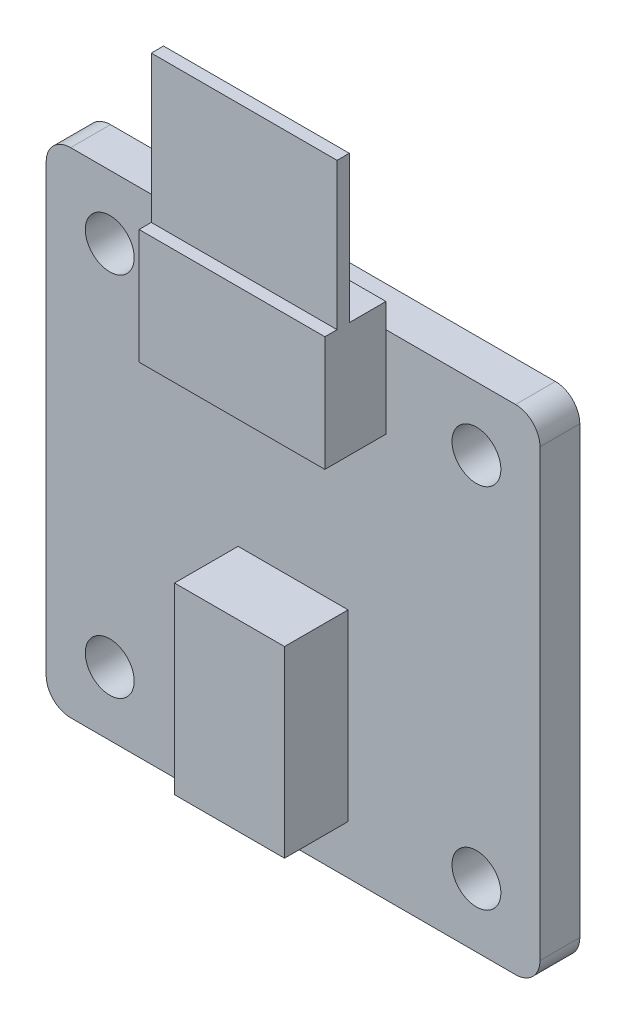
ISO-10303-21;
HEADER;
FILE_DESCRIPTION(('STEP AP214'),'2;1');
FILE_NAME('part.step','',(''),(''),'','','');
FILE_SCHEMA(('AUTOMOTIVE_DESIGN { 1 0 10303 214 1 1 1 1 }'));
ENDSEC;
DATA;
#1=APPLICATION_CONTEXT('core data for automotive mechanical design processes');
#2=APPLICATION_PROTOCOL_DEFINITION('international standard','automotive_design',2000,#1);
#3=PRODUCT_CONTEXT('',#1,'mechanical');
#4=PRODUCT('Part','Part','',(#3));
#5=PRODUCT_RELATED_PRODUCT_CATEGORY('part','',(#4));
#6=PRODUCT_DEFINITION_FORMATION('','',#4);
#7=PRODUCT_DEFINITION_CONTEXT('part definition',#1,'design');
#8=PRODUCT_DEFINITION('design','',#6,#7);
#9=PRODUCT_DEFINITION_SHAPE('','',#8);
#10=(LENGTH_UNIT() NAMED_UNIT(*) SI_UNIT(.MILLI.,.METRE.));
#11=(NAMED_UNIT(*) PLANE_ANGLE_UNIT() SI_UNIT($,.RADIAN.));
#12=(NAMED_UNIT(*) SI_UNIT($,.STERADIAN.) SOLID_ANGLE_UNIT());
#13=UNCERTAINTY_MEASURE_WITH_UNIT(LENGTH_MEASURE(1.E-05),#10,'distance_accuracy_value','');
#14=(GEOMETRIC_REPRESENTATION_CONTEXT(3) GLOBAL_UNCERTAINTY_ASSIGNED_CONTEXT((#13)) GLOBAL_UNIT_ASSIGNED_CONTEXT((#10,
#11,#12)) REPRESENTATION_CONTEXT('',''));
#15=CARTESIAN_POINT('',(0.,0.,0.));
#16=DIRECTION('',(0.,0.,1.));
#17=DIRECTION('',(1.,0.,0.));
#18=AXIS2_PLACEMENT_3D('',#15,#16,#17);
#19=CARTESIAN_POINT('',(0.,17.1,0.));
#20=DIRECTION('',(0.,-1.,0.));
#21=DIRECTION('',(0.,0.,-1.));
#22=AXIS2_PLACEMENT_3D('',#19,#20,#21);
#23=PLANE('',#22);
#24=DIRECTION('',(-1.,0.,0.));
#25=VECTOR('',#24,1.);
#26=CARTESIAN_POINT('',(3.8,17.1,3.63));
#27=LINE('',#26,#25);
#28=CARTESIAN_POINT('',(3.8,17.1,3.63));
#29=VERTEX_POINT('',#28);
#30=CARTESIAN_POINT('',(-3.8,17.1,3.63));
#31=VERTEX_POINT('',#30);
#32=EDGE_CURVE('E207',#29,#31,#27,.T.);
#33=ORIENTED_EDGE('',*,*,#32,.F.);
#34=DIRECTION('',(0.,0.,-1.));
#35=VECTOR('',#34,1.);
#36=CARTESIAN_POINT('',(3.8,17.1,4.03));
#37=LINE('',#36,#35);
#38=CARTESIAN_POINT('',(3.8,17.1,3.13));
#39=VERTEX_POINT('',#38);
#40=EDGE_CURVE('E222',#29,#39,#37,.T.);
#41=ORIENTED_EDGE('',*,*,#40,.T.);
#42=DIRECTION('',(1.,0.,0.));
#43=VECTOR('',#42,1.);
#44=CARTESIAN_POINT('',(-3.8,17.1,3.13));
#45=LINE('',#44,#43);
#46=CARTESIAN_POINT('',(-3.8,17.1,3.13));
#47=VERTEX_POINT('',#46);
#48=EDGE_CURVE('E219',#47,#39,#45,.T.);
#49=ORIENTED_EDGE('',*,*,#48,.F.);
#50=DIRECTION('',(0.,0.,1.));
#51=VECTOR('',#50,1.);
#52=CARTESIAN_POINT('',(-3.8,17.1,4.03));
#53=LINE('',#52,#51);
#54=EDGE_CURVE('E224',#47,#31,#53,.T.);
#55=ORIENTED_EDGE('',*,*,#54,.T.);
#56=EDGE_LOOP('',(#33,#41,#49,#55));
#57=FACE_BOUND('',#56,.T.);
#58=ADVANCED_FACE('F41',(#57),#23,.F.);
#59=CARTESIAN_POINT('',(3.8,11.1,4.13));
#60=DIRECTION('',(0.,-1.,0.));
#61=DIRECTION('',(0.,0.,-1.));
#62=AXIS2_PLACEMENT_3D('',#59,#60,#61);
#63=PLANE('',#62);
#64=DIRECTION('',(0.,0.,-1.));
#65=VECTOR('',#64,1.);
#66=CARTESIAN_POINT('',(3.8,11.1,4.13));
#67=LINE('',#66,#65);
#68=CARTESIAN_POINT('',(3.8,11.1,4.13));
#69=VERTEX_POINT('',#68);
#70=CARTESIAN_POINT('',(3.8,11.1,3.63));
#71=VERTEX_POINT('',#70);
#72=EDGE_CURVE('E204',#69,#71,#67,.T.);
#73=ORIENTED_EDGE('',*,*,#72,.T.);
#74=DIRECTION('',(1.,0.,0.));
#75=VECTOR('',#74,1.);
#76=CARTESIAN_POINT('',(-3.8,11.1,3.63));
#77=LINE('',#76,#75);
#78=CARTESIAN_POINT('',(-3.8,11.1,3.63));
#79=VERTEX_POINT('',#78);
#80=EDGE_CURVE('E201',#79,#71,#77,.T.);
#81=ORIENTED_EDGE('',*,*,#80,.F.);
#82=DIRECTION('',(0.,0.,-1.));
#83=VECTOR('',#82,1.);
#84=CARTESIAN_POINT('',(-3.8,11.1,4.13));
#85=LINE('',#84,#83);
#86=CARTESIAN_POINT('',(-3.8,11.1,4.13));
#87=VERTEX_POINT('',#86);
#88=EDGE_CURVE('E188',#87,#79,#85,.T.);
#89=ORIENTED_EDGE('',*,*,#88,.F.);
#90=DIRECTION('',(-1.,0.,0.));
#91=VECTOR('',#90,1.);
#92=CARTESIAN_POINT('',(3.8,11.1,4.13));
#93=LINE('',#92,#91);
#94=EDGE_CURVE('E259',#69,#87,#93,.T.);
#95=ORIENTED_EDGE('',*,*,#94,.F.);
#96=EDGE_LOOP('',(#73,#81,#89,#95));
#97=FACE_BOUND('',#96,.T.);
#98=ADVANCED_FACE('F202',(#97),#63,.F.);
#99=CARTESIAN_POINT('',(-3.8,11.1,3.13));
#100=VERTEX_POINT('',#99);
#101=CARTESIAN_POINT('',(-3.8,11.1,1.63));
#102=VERTEX_POINT('',#101);
#103=EDGE_CURVE('E199',#100,#102,#85,.T.);
#104=ORIENTED_EDGE('',*,*,#103,.F.);
#105=DIRECTION('',(-1.,0.,0.));
#106=VECTOR('',#105,1.);
#107=CARTESIAN_POINT('',(3.8,11.1,3.13));
#108=LINE('',#107,#106);
#109=CARTESIAN_POINT('',(3.8,11.1,3.13));
#110=VERTEX_POINT('',#109);
#111=EDGE_CURVE('E214',#110,#100,#108,.T.);
#112=ORIENTED_EDGE('',*,*,#111,.F.);
#113=CARTESIAN_POINT('',(3.8,11.1,1.63));
#114=VERTEX_POINT('',#113);
#115=EDGE_CURVE('E198',#110,#114,#67,.T.);
#116=ORIENTED_EDGE('',*,*,#115,.T.);
#117=DIRECTION('',(-1.,0.,0.));
#118=VECTOR('',#117,1.);
#119=CARTESIAN_POINT('',(3.8,11.1,1.63));
#120=LINE('',#119,#118);
#121=EDGE_CURVE('E269',#114,#102,#120,.T.);
#122=ORIENTED_EDGE('',*,*,#121,.T.);
#123=EDGE_LOOP('',(#104,#112,#116,#122));
#124=FACE_BOUND('',#123,.T.);
#125=ADVANCED_FACE('F424',(#124),#63,.F.);
#126=CARTESIAN_POINT('',(0.,0.,1.63));
#127=DIRECTION('',(0.,0.,1.));
#128=DIRECTION('',(1.,0.,0.));
#129=AXIS2_PLACEMENT_3D('',#126,#127,#128);
#130=PLANE('',#129);
#131=DIRECTION('',(0.,-1.,0.));
#132=VECTOR('',#131,1.);
#133=CARTESIAN_POINT('',(-3.8,11.1,1.63));
#134=LINE('',#133,#132);
#135=CARTESIAN_POINT('',(-3.8,10.1,1.63));
#136=VERTEX_POINT('',#135);
#137=CARTESIAN_POINT('',(-3.8,6.4,1.63));
#138=VERTEX_POINT('',#137);
#139=EDGE_CURVE('E11',#136,#138,#134,.T.);
#140=ORIENTED_EDGE('',*,*,#139,.F.);
#141=DIRECTION('',(-1.,0.,0.));
#142=VECTOR('',#141,1.);
#143=CARTESIAN_POINT('',(-10.1,10.1,1.63));
#144=LINE('',#143,#142);
#145=CARTESIAN_POINT('',(-9.1,10.1,1.63));
#146=VERTEX_POINT('',#145);
#147=EDGE_CURVE('E307',#136,#146,#144,.T.);
#148=ORIENTED_EDGE('',*,*,#147,.T.);
#149=CARTESIAN_POINT('',(-9.1,9.1,1.63));
#150=DIRECTION('',(0.,0.,1.));
#151=DIRECTION('',(1.,0.,0.));
#152=AXIS2_PLACEMENT_3D('',#149,#150,#151);
#153=CIRCLE('',#152,1.);
#154=CARTESIAN_POINT('',(-10.1,9.1,1.63));
#155=VERTEX_POINT('',#154);
#156=EDGE_CURVE('E348',#146,#155,#153,.T.);
#157=ORIENTED_EDGE('',*,*,#156,.T.);
#158=DIRECTION('',(0.,-1.,0.));
#159=VECTOR('',#158,1.);
#160=CARTESIAN_POINT('',(-10.1,10.1,1.63));
#161=LINE('',#160,#159);
#162=CARTESIAN_POINT('',(-10.1,-9.1,1.63));
#163=VERTEX_POINT('',#162);
#164=EDGE_CURVE('E311',#155,#163,#161,.T.);
#165=ORIENTED_EDGE('',*,*,#164,.T.);
#166=CARTESIAN_POINT('',(-9.1,-9.1,1.63));
#167=DIRECTION('',(0.,0.,1.));
#168=DIRECTION('',(1.,0.,0.));
#169=AXIS2_PLACEMENT_3D('',#166,#167,#168);
#170=CIRCLE('',#169,1.);
#171=CARTESIAN_POINT('',(-9.1,-10.1,1.63));
#172=VERTEX_POINT('',#171);
#173=EDGE_CURVE('E346',#163,#172,#170,.T.);
#174=ORIENTED_EDGE('',*,*,#173,.T.);
#175=DIRECTION('',(1.,0.,0.));
#176=VECTOR('',#175,1.);
#177=CARTESIAN_POINT('',(-10.1,-10.1,1.63));
#178=LINE('',#177,#176);
#179=CARTESIAN_POINT('',(9.1,-10.1,1.63));
#180=VERTEX_POINT('',#179);
#181=EDGE_CURVE('E315',#172,#180,#178,.T.);
#182=ORIENTED_EDGE('',*,*,#181,.T.);
#183=CARTESIAN_POINT('',(9.1,-9.1,1.63));
#184=DIRECTION('',(0.,0.,1.));
#185=DIRECTION('',(1.,0.,0.));
#186=AXIS2_PLACEMENT_3D('',#183,#184,#185);
#187=CIRCLE('',#186,1.);
#188=CARTESIAN_POINT('',(10.1,-9.1,1.63));
#189=VERTEX_POINT('',#188);
#190=EDGE_CURVE('E352',#180,#189,#187,.T.);
#191=ORIENTED_EDGE('',*,*,#190,.T.);
#192=DIRECTION('',(0.,1.,0.));
#193=VECTOR('',#192,1.);
#194=CARTESIAN_POINT('',(10.1,10.1,1.63));
#195=LINE('',#194,#193);
#196=CARTESIAN_POINT('',(10.1,9.1,1.63));
#197=VERTEX_POINT('',#196);
#198=EDGE_CURVE('E304',#189,#197,#195,.T.);
#199=ORIENTED_EDGE('',*,*,#198,.T.);
#200=CARTESIAN_POINT('',(9.1,9.1,1.63));
#201=DIRECTION('',(0.,0.,1.));
#202=DIRECTION('',(1.,0.,0.));
#203=AXIS2_PLACEMENT_3D('',#200,#201,#202);
#204=CIRCLE('',#203,1.);
#205=CARTESIAN_POINT('',(9.1,10.1,1.63));
#206=VERTEX_POINT('',#205);
#207=EDGE_CURVE('E350',#197,#206,#204,.T.);
#208=ORIENTED_EDGE('',*,*,#207,.T.);
#209=CARTESIAN_POINT('',(3.8,10.1,1.63));
#210=VERTEX_POINT('',#209);
#211=EDGE_CURVE('E309',#206,#210,#144,.T.);
#212=ORIENTED_EDGE('',*,*,#211,.T.);
#213=DIRECTION('',(0.,1.,0.));
#214=VECTOR('',#213,1.);
#215=CARTESIAN_POINT('',(3.8,6.4,1.63));
#216=LINE('',#215,#214);
#217=CARTESIAN_POINT('',(3.8,6.4,1.63));
#218=VERTEX_POINT('',#217);
#219=EDGE_CURVE('E266',#218,#210,#216,.T.);
#220=ORIENTED_EDGE('',*,*,#219,.F.);
#221=DIRECTION('',(1.,0.,0.));
#222=VECTOR('',#221,1.);
#223=CARTESIAN_POINT('',(0.,6.4,1.63));
#224=LINE('',#223,#222);
#225=EDGE_CURVE('E254',#138,#218,#224,.T.);
#226=ORIENTED_EDGE('',*,*,#225,.F.);
#227=EDGE_LOOP('',(#140,#148,#157,#165,#174,#182,#191,#199,#208,#212,#220,#226));
#228=FACE_BOUND('',#227,.T.);
#229=CARTESIAN_POINT('',(-7.49999999999958,-7.5,1.63));
#230=DIRECTION('',(0.,0.,1.));
#231=DIRECTION('',(1.,0.,0.));
#232=AXIS2_PLACEMENT_3D('',#229,#230,#231);
#233=CIRCLE('',#232,1.00000000000023);
#234=CARTESIAN_POINT('',(-6.49999999999935,-7.5,1.63));
#235=VERTEX_POINT('',#234);
#236=EDGE_CURVE('E300',#235,#235,#233,.F.);
#237=ORIENTED_EDGE('',*,*,#236,.T.);
#238=EDGE_LOOP('',(#237));
#239=FACE_BOUND('',#238,.T.);
#240=CARTESIAN_POINT('',(7.50000000000042,-7.49999999999958,1.63));
#241=DIRECTION('',(0.,0.,1.));
#242=DIRECTION('',(1.,0.,0.));
#243=AXIS2_PLACEMENT_3D('',#240,#241,#242);
#244=CIRCLE('',#243,1.0000000000006);
#245=CARTESIAN_POINT('',(8.50000000000102,-7.49999999999958,1.63));
#246=VERTEX_POINT('',#245);
#247=EDGE_CURVE('E297',#246,#246,#244,.F.);
#248=ORIENTED_EDGE('',*,*,#247,.T.);
#249=EDGE_LOOP('',(#248));
#250=FACE_BOUND('',#249,.T.);
#251=CARTESIAN_POINT('',(7.5,7.50000000000042,1.63));
#252=DIRECTION('',(0.,0.,1.));
#253=DIRECTION('',(1.,0.,0.));
#254=AXIS2_PLACEMENT_3D('',#251,#252,#253);
#255=CIRCLE('',#254,1.00000000000044);
#256=CARTESIAN_POINT('',(8.50000000000044,7.50000000000042,1.63));
#257=VERTEX_POINT('',#256);
#258=EDGE_CURVE('E294',#257,#257,#255,.F.);
#259=ORIENTED_EDGE('',*,*,#258,.T.);
#260=EDGE_LOOP('',(#259));
#261=FACE_BOUND('',#260,.T.);
#262=CARTESIAN_POINT('',(-7.5,7.5,1.63));
#263=DIRECTION('',(0.,0.,1.));
#264=DIRECTION('',(1.,0.,0.));
#265=AXIS2_PLACEMENT_3D('',#262,#263,#264);
#266=CIRCLE('',#265,1.);
#267=CARTESIAN_POINT('',(-6.5,7.5,1.63));
#268=VERTEX_POINT('',#267);
#269=EDGE_CURVE('E291',#268,#268,#266,.F.);
#270=ORIENTED_EDGE('',*,*,#269,.T.);
#271=EDGE_LOOP('',(#270));
#272=FACE_BOUND('',#271,.T.);
#273=DIRECTION('',(-1.,0.,0.));
#274=VECTOR('',#273,1.);
#275=CARTESIAN_POINT('',(-2.25,-0.6,1.63));
#276=LINE('',#275,#274);
#277=CARTESIAN_POINT('',(2.25,-0.6,1.63));
#278=VERTEX_POINT('',#277);
#279=CARTESIAN_POINT('',(-2.25,-0.6,1.63));
#280=VERTEX_POINT('',#279);
#281=EDGE_CURVE('E239',#278,#280,#276,.T.);
#282=ORIENTED_EDGE('',*,*,#281,.F.);
#283=DIRECTION('',(0.,1.,0.));
#284=VECTOR('',#283,1.);
#285=CARTESIAN_POINT('',(2.25,-0.6,1.63));
#286=LINE('',#285,#284);
#287=CARTESIAN_POINT('',(2.25,-8.1,1.63));
#288=VERTEX_POINT('',#287);
#289=EDGE_CURVE('E226',#288,#278,#286,.T.);
#290=ORIENTED_EDGE('',*,*,#289,.F.);
#291=DIRECTION('',(1.,0.,0.));
#292=VECTOR('',#291,1.);
#293=CARTESIAN_POINT('',(0.,-8.1,1.63));
#294=LINE('',#293,#292);
#295=CARTESIAN_POINT('',(-2.25,-8.1,1.63));
#296=VERTEX_POINT('',#295);
#297=EDGE_CURVE('E231',#296,#288,#294,.T.);
#298=ORIENTED_EDGE('',*,*,#297,.F.);
#299=DIRECTION('',(0.,-1.,0.));
#300=VECTOR('',#299,1.);
#301=CARTESIAN_POINT('',(-2.25,-8.1,1.63));
#302=LINE('',#301,#300);
#303=EDGE_CURVE('E241',#280,#296,#302,.T.);
#304=ORIENTED_EDGE('',*,*,#303,.F.);
#305=EDGE_LOOP('',(#282,#290,#298,#304));
#306=FACE_BOUND('',#305,.T.);
#307=ADVANCED_FACE('F383',(#228,#239,#250,#261,#272,#306),#130,.T.);
#308=CARTESIAN_POINT('',(10.1,10.1,1.63));
#309=DIRECTION('',(-1.,0.,0.));
#310=DIRECTION('',(0.,-1.,0.));
#311=AXIS2_PLACEMENT_3D('',#308,#309,#310);
#312=PLANE('',#311);
#313=ORIENTED_EDGE('',*,*,#198,.F.);
#314=DIRECTION('',(0.,0.,-1.));
#315=VECTOR('',#314,1.);
#316=CARTESIAN_POINT('',(10.1,-9.1,1.63));
#317=LINE('',#316,#315);
#318=CARTESIAN_POINT('',(10.1,-9.1,0.));
#319=VERTEX_POINT('',#318);
#320=EDGE_CURVE('E330',#189,#319,#317,.T.);
#321=ORIENTED_EDGE('',*,*,#320,.T.);
#322=DIRECTION('',(0.,1.,0.));
#323=VECTOR('',#322,1.);
#324=CARTESIAN_POINT('',(10.1,10.1,0.));
#325=LINE('',#324,#323);
#326=CARTESIAN_POINT('',(10.1,9.1,0.));
#327=VERTEX_POINT('',#326);
#328=EDGE_CURVE('E303',#319,#327,#325,.T.);
#329=ORIENTED_EDGE('',*,*,#328,.T.);
#330=DIRECTION('',(0.,0.,-1.));
#331=VECTOR('',#330,1.);
#332=CARTESIAN_POINT('',(10.1,9.1,1.63));
#333=LINE('',#332,#331);
#334=EDGE_CURVE('E318',#327,#197,#333,.F.);
#335=ORIENTED_EDGE('',*,*,#334,.T.);
#336=EDGE_LOOP('',(#313,#321,#329,#335));
#337=FACE_BOUND('',#336,.T.);
#338=ADVANCED_FACE('F390',(#337),#312,.F.);
#339=CARTESIAN_POINT('',(-10.1,10.1,1.63));
#340=DIRECTION('',(0.,-1.,0.));
#341=DIRECTION('',(0.,0.,-1.));
#342=AXIS2_PLACEMENT_3D('',#339,#340,#341);
#343=PLANE('',#342);
#344=ORIENTED_EDGE('',*,*,#211,.F.);
#345=DIRECTION('',(0.,0.,-1.));
#346=VECTOR('',#345,1.);
#347=CARTESIAN_POINT('',(9.1,10.1,1.63));
#348=LINE('',#347,#346);
#349=CARTESIAN_POINT('',(9.1,10.1,0.));
#350=VERTEX_POINT('',#349);
#351=EDGE_CURVE('E357',#206,#350,#348,.T.);
#352=ORIENTED_EDGE('',*,*,#351,.T.);
#353=DIRECTION('',(-1.,0.,0.));
#354=VECTOR('',#353,1.);
#355=CARTESIAN_POINT('',(-10.1,10.1,0.));
#356=LINE('',#355,#354);
#357=CARTESIAN_POINT('',(-9.1,10.1,0.));
#358=VERTEX_POINT('',#357);
#359=EDGE_CURVE('E321',#350,#358,#356,.T.);
#360=ORIENTED_EDGE('',*,*,#359,.T.);
#361=DIRECTION('',(0.,0.,-1.));
#362=VECTOR('',#361,1.);
#363=CARTESIAN_POINT('',(-9.1,10.1,1.63));
#364=LINE('',#363,#362);
#365=EDGE_CURVE('E354',#358,#146,#364,.F.);
#366=ORIENTED_EDGE('',*,*,#365,.T.);
#367=ORIENTED_EDGE('',*,*,#147,.F.);
#368=EDGE_CURVE('E312',#210,#136,#144,.T.);
#369=ORIENTED_EDGE('',*,*,#368,.F.);
#370=EDGE_LOOP('',(#344,#352,#360,#366,#367,#369));
#371=FACE_BOUND('',#370,.T.);
#372=ADVANCED_FACE('F398',(#371),#343,.F.);
#373=CARTESIAN_POINT('',(-10.1,10.1,1.63));
#374=DIRECTION('',(1.,0.,0.));
#375=DIRECTION('',(0.,1.,0.));
#376=AXIS2_PLACEMENT_3D('',#373,#374,#375);
#377=PLANE('',#376);
#378=ORIENTED_EDGE('',*,*,#164,.F.);
#379=DIRECTION('',(0.,0.,-1.));
#380=VECTOR('',#379,1.);
#381=CARTESIAN_POINT('',(-10.1,9.1,1.63));
#382=LINE('',#381,#380);
#383=CARTESIAN_POINT('',(-10.1,9.1,0.));
#384=VERTEX_POINT('',#383);
#385=EDGE_CURVE('E45',#155,#384,#382,.T.);
#386=ORIENTED_EDGE('',*,*,#385,.T.);
#387=DIRECTION('',(0.,-1.,0.));
#388=VECTOR('',#387,1.);
#389=CARTESIAN_POINT('',(-10.1,10.1,0.));
#390=LINE('',#389,#388);
#391=CARTESIAN_POINT('',(-10.1,-9.1,0.));
#392=VERTEX_POINT('',#391);
#393=EDGE_CURVE('E324',#384,#392,#390,.T.);
#394=ORIENTED_EDGE('',*,*,#393,.T.);
#395=DIRECTION('',(0.,0.,-1.));
#396=VECTOR('',#395,1.);
#397=CARTESIAN_POINT('',(-10.1,-9.1,1.63));
#398=LINE('',#397,#396);
#399=EDGE_CURVE('E359',#392,#163,#398,.F.);
#400=ORIENTED_EDGE('',*,*,#399,.T.);
#401=EDGE_LOOP('',(#378,#386,#394,#400));
#402=FACE_BOUND('',#401,.T.);
#403=ADVANCED_FACE('F366',(#402),#377,.F.);
#404=CARTESIAN_POINT('',(-10.1,-10.1,1.63));
#405=DIRECTION('',(0.,1.,0.));
#406=DIRECTION('',(0.,0.,1.));
#407=AXIS2_PLACEMENT_3D('',#404,#405,#406);
#408=PLANE('',#407);
#409=DIRECTION('',(1.,0.,0.));
#410=VECTOR('',#409,1.);
#411=CARTESIAN_POINT('',(-10.1,-10.1,0.));
#412=LINE('',#411,#410);
#413=CARTESIAN_POINT('',(-9.1,-10.1,0.));
#414=VERTEX_POINT('',#413);
#415=CARTESIAN_POINT('',(9.1,-10.1,0.));
#416=VERTEX_POINT('',#415);
#417=EDGE_CURVE('E308',#414,#416,#412,.T.);
#418=ORIENTED_EDGE('',*,*,#417,.T.);
#419=DIRECTION('',(0.,0.,-1.));
#420=VECTOR('',#419,1.);
#421=CARTESIAN_POINT('',(9.1,-10.1,1.63));
#422=LINE('',#421,#420);
#423=EDGE_CURVE('E344',#416,#180,#422,.F.);
#424=ORIENTED_EDGE('',*,*,#423,.T.);
#425=ORIENTED_EDGE('',*,*,#181,.F.);
#426=DIRECTION('',(0.,0.,-1.));
#427=VECTOR('',#426,1.);
#428=CARTESIAN_POINT('',(-9.1,-10.1,1.63));
#429=LINE('',#428,#427);
#430=EDGE_CURVE('E341',#172,#414,#429,.T.);
#431=ORIENTED_EDGE('',*,*,#430,.T.);
#432=EDGE_LOOP('',(#418,#424,#425,#431));
#433=FACE_BOUND('',#432,.T.);
#434=ADVANCED_FACE('F379',(#433),#408,.F.);
#435=CARTESIAN_POINT('',(0.,0.,0.));
#436=DIRECTION('',(0.,0.,1.));
#437=DIRECTION('',(1.,0.,0.));
#438=AXIS2_PLACEMENT_3D('',#435,#436,#437);
#439=PLANE('',#438);
#440=CARTESIAN_POINT('',(-7.49999999999958,-7.5,0.));
#441=DIRECTION('',(0.,0.,1.));
#442=DIRECTION('',(1.,0.,0.));
#443=AXIS2_PLACEMENT_3D('',#440,#441,#442);
#444=CIRCLE('',#443,1.00000000000023);
#445=CARTESIAN_POINT('',(-6.49999999999935,-7.5,0.));
#446=VERTEX_POINT('',#445);
#447=EDGE_CURVE('E279',#446,#446,#444,.T.);
#448=ORIENTED_EDGE('',*,*,#447,.T.);
#449=EDGE_LOOP('',(#448));
#450=FACE_BOUND('',#449,.T.);
#451=CARTESIAN_POINT('',(7.50000000000042,-7.49999999999958,0.));
#452=DIRECTION('',(0.,0.,1.));
#453=DIRECTION('',(1.,0.,0.));
#454=AXIS2_PLACEMENT_3D('',#451,#452,#453);
#455=CIRCLE('',#454,1.0000000000006);
#456=CARTESIAN_POINT('',(8.50000000000102,-7.49999999999958,0.));
#457=VERTEX_POINT('',#456);
#458=EDGE_CURVE('E284',#457,#457,#455,.T.);
#459=ORIENTED_EDGE('',*,*,#458,.T.);
#460=EDGE_LOOP('',(#459));
#461=FACE_BOUND('',#460,.T.);
#462=CARTESIAN_POINT('',(7.5,7.50000000000042,0.));
#463=DIRECTION('',(0.,0.,1.));
#464=DIRECTION('',(1.,0.,0.));
#465=AXIS2_PLACEMENT_3D('',#462,#463,#464);
#466=CIRCLE('',#465,1.00000000000044);
#467=CARTESIAN_POINT('',(8.50000000000044,7.50000000000042,0.));
#468=VERTEX_POINT('',#467);
#469=EDGE_CURVE('E280',#468,#468,#466,.T.);
#470=ORIENTED_EDGE('',*,*,#469,.T.);
#471=EDGE_LOOP('',(#470));
#472=FACE_BOUND('',#471,.T.);
#473=CARTESIAN_POINT('',(-7.5,7.5,0.));
#474=DIRECTION('',(0.,0.,1.));
#475=DIRECTION('',(1.,0.,0.));
#476=AXIS2_PLACEMENT_3D('',#473,#474,#475);
#477=CIRCLE('',#476,1.);
#478=CARTESIAN_POINT('',(-6.5,7.5,0.));
#479=VERTEX_POINT('',#478);
#480=EDGE_CURVE('E283',#479,#479,#477,.T.);
#481=ORIENTED_EDGE('',*,*,#480,.T.);
#482=EDGE_LOOP('',(#481));
#483=FACE_BOUND('',#482,.T.);
#484=ORIENTED_EDGE('',*,*,#328,.F.);
#485=CARTESIAN_POINT('',(9.1,-9.1,0.));
#486=DIRECTION('',(0.,0.,1.));
#487=DIRECTION('',(1.,0.,0.));
#488=AXIS2_PLACEMENT_3D('',#485,#486,#487);
#489=CIRCLE('',#488,1.);
#490=EDGE_CURVE('E339',#319,#416,#489,.F.);
#491=ORIENTED_EDGE('',*,*,#490,.T.);
#492=ORIENTED_EDGE('',*,*,#417,.F.);
#493=CARTESIAN_POINT('',(-9.1,-9.1,0.));
#494=DIRECTION('',(0.,0.,1.));
#495=DIRECTION('',(1.,0.,0.));
#496=AXIS2_PLACEMENT_3D('',#493,#494,#495);
#497=CIRCLE('',#496,1.);
#498=EDGE_CURVE('E333',#414,#392,#497,.F.);
#499=ORIENTED_EDGE('',*,*,#498,.T.);
#500=ORIENTED_EDGE('',*,*,#393,.F.);
#501=CARTESIAN_POINT('',(-9.1,9.1,0.));
#502=DIRECTION('',(0.,0.,1.));
#503=DIRECTION('',(1.,0.,0.));
#504=AXIS2_PLACEMENT_3D('',#501,#502,#503);
#505=CIRCLE('',#504,1.);
#506=EDGE_CURVE('E335',#384,#358,#505,.F.);
#507=ORIENTED_EDGE('',*,*,#506,.T.);
#508=ORIENTED_EDGE('',*,*,#359,.F.);
#509=CARTESIAN_POINT('',(9.1,9.1,0.));
#510=DIRECTION('',(0.,0.,1.));
#511=DIRECTION('',(1.,0.,0.));
#512=AXIS2_PLACEMENT_3D('',#509,#510,#511);
#513=CIRCLE('',#512,1.);
#514=EDGE_CURVE('E337',#350,#327,#513,.F.);
#515=ORIENTED_EDGE('',*,*,#514,.T.);
#516=EDGE_LOOP('',(#484,#491,#492,#499,#500,#507,#508,#515));
#517=FACE_BOUND('',#516,.T.);
#518=ADVANCED_FACE('F371',(#450,#461,#472,#483,#517),#439,.F.);
#519=CARTESIAN_POINT('',(9.1,-9.1,1.63));
#520=DIRECTION('',(0.,0.,-1.));
#521=DIRECTION('',(-1.,0.,0.));
#522=AXIS2_PLACEMENT_3D('',#519,#520,#521);
#523=CYLINDRICAL_SURFACE('',#522,1.);
#524=ORIENTED_EDGE('',*,*,#190,.F.);
#525=ORIENTED_EDGE('',*,*,#423,.F.);
#526=ORIENTED_EDGE('',*,*,#490,.F.);
#527=ORIENTED_EDGE('',*,*,#320,.F.);
#528=EDGE_LOOP('',(#524,#525,#526,#527));
#529=FACE_BOUND('',#528,.T.);
#530=ADVANCED_FACE('F388',(#529),#523,.T.);
#531=CARTESIAN_POINT('',(9.1,9.1,1.63));
#532=DIRECTION('',(0.,0.,-1.));
#533=DIRECTION('',(-1.,0.,0.));
#534=AXIS2_PLACEMENT_3D('',#531,#532,#533);
#535=CYLINDRICAL_SURFACE('',#534,1.);
#536=ORIENTED_EDGE('',*,*,#207,.F.);
#537=ORIENTED_EDGE('',*,*,#334,.F.);
#538=ORIENTED_EDGE('',*,*,#514,.F.);
#539=ORIENTED_EDGE('',*,*,#351,.F.);
#540=EDGE_LOOP('',(#536,#537,#538,#539));
#541=FACE_BOUND('',#540,.T.);
#542=ADVANCED_FACE('F395',(#541),#535,.T.);
#543=CARTESIAN_POINT('',(-9.1,9.1,1.63));
#544=DIRECTION('',(0.,0.,-1.));
#545=DIRECTION('',(-1.,0.,0.));
#546=AXIS2_PLACEMENT_3D('',#543,#544,#545);
#547=CYLINDRICAL_SURFACE('',#546,1.);
#548=ORIENTED_EDGE('',*,*,#156,.F.);
#549=ORIENTED_EDGE('',*,*,#365,.F.);
#550=ORIENTED_EDGE('',*,*,#506,.F.);
#551=ORIENTED_EDGE('',*,*,#385,.F.);
#552=EDGE_LOOP('',(#548,#549,#550,#551));
#553=FACE_BOUND('',#552,.T.);
#554=ADVANCED_FACE('F500',(#553),#547,.T.);
#555=CARTESIAN_POINT('',(-9.1,-9.1,1.63));
#556=DIRECTION('',(0.,0.,-1.));
#557=DIRECTION('',(-1.,0.,0.));
#558=AXIS2_PLACEMENT_3D('',#555,#556,#557);
#559=CYLINDRICAL_SURFACE('',#558,1.);
#560=ORIENTED_EDGE('',*,*,#173,.F.);
#561=ORIENTED_EDGE('',*,*,#399,.F.);
#562=ORIENTED_EDGE('',*,*,#498,.F.);
#563=ORIENTED_EDGE('',*,*,#430,.F.);
#564=EDGE_LOOP('',(#560,#561,#562,#563));
#565=FACE_BOUND('',#564,.T.);
#566=ADVANCED_FACE('F43',(#565),#559,.T.);
#567=CARTESIAN_POINT('',(-7.5,7.5,6.63));
#568=DIRECTION('',(0.,0.,-1.));
#569=DIRECTION('',(-1.,0.,0.));
#570=AXIS2_PLACEMENT_3D('',#567,#568,#569);
#571=CYLINDRICAL_SURFACE('',#570,1.);
#572=ORIENTED_EDGE('',*,*,#269,.F.);
#573=EDGE_LOOP('',(#572));
#574=FACE_BOUND('',#573,.T.);
#575=ORIENTED_EDGE('',*,*,#480,.F.);
#576=EDGE_LOOP('',(#575));
#577=FACE_BOUND('',#576,.T.);
#578=ADVANCED_FACE('F473',(#574,#577),#571,.F.);
#579=CARTESIAN_POINT('',(7.5,7.50000000000042,6.63));
#580=DIRECTION('',(0.,0.,-1.));
#581=DIRECTION('',(-1.,0.,0.));
#582=AXIS2_PLACEMENT_3D('',#579,#580,#581);
#583=CYLINDRICAL_SURFACE('',#582,1.00000000000044);
#584=ORIENTED_EDGE('',*,*,#258,.F.);
#585=EDGE_LOOP('',(#584));
#586=FACE_BOUND('',#585,.T.);
#587=ORIENTED_EDGE('',*,*,#469,.F.);
#588=EDGE_LOOP('',(#587));
#589=FACE_BOUND('',#588,.T.);
#590=ADVANCED_FACE('F469',(#586,#589),#583,.F.);
#591=CARTESIAN_POINT('',(7.50000000000042,-7.49999999999958,6.63));
#592=DIRECTION('',(0.,0.,-1.));
#593=DIRECTION('',(-1.,0.,0.));
#594=AXIS2_PLACEMENT_3D('',#591,#592,#593);
#595=CYLINDRICAL_SURFACE('',#594,1.0000000000006);
#596=ORIENTED_EDGE('',*,*,#247,.F.);
#597=EDGE_LOOP('',(#596));
#598=FACE_BOUND('',#597,.T.);
#599=ORIENTED_EDGE('',*,*,#458,.F.);
#600=EDGE_LOOP('',(#599));
#601=FACE_BOUND('',#600,.T.);
#602=ADVANCED_FACE('F472',(#598,#601),#595,.F.);
#603=CARTESIAN_POINT('',(-7.49999999999958,-7.5,6.63));
#604=DIRECTION('',(0.,0.,-1.));
#605=DIRECTION('',(-1.,0.,0.));
#606=AXIS2_PLACEMENT_3D('',#603,#604,#605);
#607=CYLINDRICAL_SURFACE('',#606,1.00000000000023);
#608=ORIENTED_EDGE('',*,*,#236,.F.);
#609=EDGE_LOOP('',(#608));
#610=FACE_BOUND('',#609,.T.);
#611=ORIENTED_EDGE('',*,*,#447,.F.);
#612=EDGE_LOOP('',(#611));
#613=FACE_BOUND('',#612,.T.);
#614=ADVANCED_FACE('F462',(#610,#613),#607,.F.);
#615=CARTESIAN_POINT('',(0.,0.,1.63));
#616=DIRECTION('',(0.,0.,1.));
#617=DIRECTION('',(1.,0.,0.));
#618=AXIS2_PLACEMENT_3D('',#615,#616,#617);
#619=PLANE('',#618);
#620=EDGE_CURVE('E265',#210,#114,#216,.T.);
#621=ORIENTED_EDGE('',*,*,#620,.F.);
#622=ORIENTED_EDGE('',*,*,#368,.T.);
#623=EDGE_CURVE('E51',#102,#136,#134,.T.);
#624=ORIENTED_EDGE('',*,*,#623,.F.);
#625=ORIENTED_EDGE('',*,*,#121,.F.);
#626=EDGE_LOOP('',(#621,#622,#624,#625));
#627=FACE_BOUND('',#626,.T.);
#628=ADVANCED_FACE('F416',(#627),#619,.F.);
#629=CARTESIAN_POINT('',(0.,6.4,4.13));
#630=DIRECTION('',(0.,1.,0.));
#631=DIRECTION('',(0.,0.,1.));
#632=AXIS2_PLACEMENT_3D('',#629,#630,#631);
#633=PLANE('',#632);
#634=ORIENTED_EDGE('',*,*,#225,.T.);
#635=DIRECTION('',(0.,0.,-1.));
#636=VECTOR('',#635,1.);
#637=CARTESIAN_POINT('',(3.8,6.4,4.13));
#638=LINE('',#637,#636);
#639=CARTESIAN_POINT('',(3.8,6.4,4.13));
#640=VERTEX_POINT('',#639);
#641=EDGE_CURVE('E276',#640,#218,#638,.T.);
#642=ORIENTED_EDGE('',*,*,#641,.F.);
#643=DIRECTION('',(1.,0.,0.));
#644=VECTOR('',#643,1.);
#645=CARTESIAN_POINT('',(-3.8,6.4,4.13));
#646=LINE('',#645,#644);
#647=CARTESIAN_POINT('',(-3.8,6.4,4.13));
#648=VERTEX_POINT('',#647);
#649=EDGE_CURVE('E255',#648,#640,#646,.T.);
#650=ORIENTED_EDGE('',*,*,#649,.F.);
#651=DIRECTION('',(0.,0.,-1.));
#652=VECTOR('',#651,1.);
#653=CARTESIAN_POINT('',(-3.8,6.4,4.13));
#654=LINE('',#653,#652);
#655=EDGE_CURVE('E262',#648,#138,#654,.T.);
#656=ORIENTED_EDGE('',*,*,#655,.T.);
#657=EDGE_LOOP('',(#634,#642,#650,#656));
#658=FACE_BOUND('',#657,.T.);
#659=ADVANCED_FACE('F408',(#658),#633,.F.);
#660=CARTESIAN_POINT('',(3.8,6.4,4.13));
#661=DIRECTION('',(-1.,0.,0.));
#662=DIRECTION('',(0.,0.,1.));
#663=AXIS2_PLACEMENT_3D('',#660,#661,#662);
#664=PLANE('',#663);
#665=DIRECTION('',(0.,1.,0.));
#666=VECTOR('',#665,1.);
#667=CARTESIAN_POINT('',(3.8,11.1,3.63));
#668=LINE('',#667,#666);
#669=EDGE_CURVE('E58',#71,#29,#668,.T.);
#670=ORIENTED_EDGE('',*,*,#669,.F.);
#671=ORIENTED_EDGE('',*,*,#72,.F.);
#672=DIRECTION('',(0.,1.,0.));
#673=VECTOR('',#672,1.);
#674=CARTESIAN_POINT('',(3.8,6.4,4.13));
#675=LINE('',#674,#673);
#676=EDGE_CURVE('E257',#640,#69,#675,.T.);
#677=ORIENTED_EDGE('',*,*,#676,.F.);
#678=ORIENTED_EDGE('',*,*,#641,.T.);
#679=ORIENTED_EDGE('',*,*,#219,.T.);
#680=ORIENTED_EDGE('',*,*,#620,.T.);
#681=ORIENTED_EDGE('',*,*,#115,.F.);
#682=DIRECTION('',(0.,-1.,0.));
#683=VECTOR('',#682,1.);
#684=CARTESIAN_POINT('',(3.8,17.1,3.13));
#685=LINE('',#684,#683);
#686=EDGE_CURVE('E212',#39,#110,#685,.T.);
#687=ORIENTED_EDGE('',*,*,#686,.F.);
#688=ORIENTED_EDGE('',*,*,#40,.F.);
#689=EDGE_LOOP('',(#670,#671,#677,#678,#679,#680,#681,#687,#688));
#690=FACE_BOUND('',#689,.T.);
#691=ADVANCED_FACE('F411',(#690),#664,.F.);
#692=CARTESIAN_POINT('',(-3.8,11.1,4.13));
#693=DIRECTION('',(1.,0.,0.));
#694=DIRECTION('',(0.,0.,-1.));
#695=AXIS2_PLACEMENT_3D('',#692,#693,#694);
#696=PLANE('',#695);
#697=ORIENTED_EDGE('',*,*,#88,.T.);
#698=DIRECTION('',(0.,-1.,0.));
#699=VECTOR('',#698,1.);
#700=CARTESIAN_POINT('',(-3.8,17.1,3.63));
#701=LINE('',#700,#699);
#702=EDGE_CURVE('E192',#31,#79,#701,.T.);
#703=ORIENTED_EDGE('',*,*,#702,.F.);
#704=ORIENTED_EDGE('',*,*,#54,.F.);
#705=DIRECTION('',(0.,1.,0.));
#706=VECTOR('',#705,1.);
#707=CARTESIAN_POINT('',(-3.8,11.1,3.13));
#708=LINE('',#707,#706);
#709=EDGE_CURVE('E216',#100,#47,#708,.T.);
#710=ORIENTED_EDGE('',*,*,#709,.F.);
#711=ORIENTED_EDGE('',*,*,#103,.T.);
#712=ORIENTED_EDGE('',*,*,#623,.T.);
#713=ORIENTED_EDGE('',*,*,#139,.T.);
#714=ORIENTED_EDGE('',*,*,#655,.F.);
#715=DIRECTION('',(0.,-1.,0.));
#716=VECTOR('',#715,1.);
#717=CARTESIAN_POINT('',(-3.8,11.1,4.13));
#718=LINE('',#717,#716);
#719=EDGE_CURVE('E195',#87,#648,#718,.T.);
#720=ORIENTED_EDGE('',*,*,#719,.F.);
#721=EDGE_LOOP('',(#697,#703,#704,#710,#711,#712,#713,#714,#720));
#722=FACE_BOUND('',#721,.T.);
#723=ADVANCED_FACE('F190',(#722),#696,.F.);
#724=CARTESIAN_POINT('',(0.,0.,4.13));
#725=DIRECTION('',(0.,0.,1.));
#726=DIRECTION('',(1.,0.,0.));
#727=AXIS2_PLACEMENT_3D('',#724,#725,#726);
#728=PLANE('',#727);
#729=ORIENTED_EDGE('',*,*,#649,.T.);
#730=ORIENTED_EDGE('',*,*,#676,.T.);
#731=ORIENTED_EDGE('',*,*,#94,.T.);
#732=ORIENTED_EDGE('',*,*,#719,.T.);
#733=EDGE_LOOP('',(#729,#730,#731,#732));
#734=FACE_BOUND('',#733,.T.);
#735=ADVANCED_FACE('F413',(#734),#728,.T.);
#736=CARTESIAN_POINT('',(2.25,-0.6,4.23));
#737=DIRECTION('',(-1.,0.,0.));
#738=DIRECTION('',(0.,0.,1.));
#739=AXIS2_PLACEMENT_3D('',#736,#737,#738);
#740=PLANE('',#739);
#741=ORIENTED_EDGE('',*,*,#289,.T.);
#742=DIRECTION('',(0.,0.,-1.));
#743=VECTOR('',#742,1.);
#744=CARTESIAN_POINT('',(2.25,-0.6,4.23));
#745=LINE('',#744,#743);
#746=CARTESIAN_POINT('',(2.25,-0.6,4.23));
#747=VERTEX_POINT('',#746);
#748=EDGE_CURVE('E248',#747,#278,#745,.T.);
#749=ORIENTED_EDGE('',*,*,#748,.F.);
#750=DIRECTION('',(0.,1.,0.));
#751=VECTOR('',#750,1.);
#752=CARTESIAN_POINT('',(2.25,-0.6,4.23));
#753=LINE('',#752,#751);
#754=CARTESIAN_POINT('',(2.25,-8.1,4.23));
#755=VERTEX_POINT('',#754);
#756=EDGE_CURVE('E230',#755,#747,#753,.T.);
#757=ORIENTED_EDGE('',*,*,#756,.F.);
#758=DIRECTION('',(0.,0.,-1.));
#759=VECTOR('',#758,1.);
#760=CARTESIAN_POINT('',(2.25,-8.1,4.23));
#761=LINE('',#760,#759);
#762=EDGE_CURVE('E251',#755,#288,#761,.T.);
#763=ORIENTED_EDGE('',*,*,#762,.T.);
#764=EDGE_LOOP('',(#741,#749,#757,#763));
#765=FACE_BOUND('',#764,.T.);
#766=ADVANCED_FACE('F453',(#765),#740,.F.);
#767=CARTESIAN_POINT('',(-2.25,-0.6,4.23));
#768=DIRECTION('',(0.,-1.,0.));
#769=DIRECTION('',(0.,0.,-1.));
#770=AXIS2_PLACEMENT_3D('',#767,#768,#769);
#771=PLANE('',#770);
#772=ORIENTED_EDGE('',*,*,#281,.T.);
#773=DIRECTION('',(0.,0.,-1.));
#774=VECTOR('',#773,1.);
#775=CARTESIAN_POINT('',(-2.25,-0.6,4.23));
#776=LINE('',#775,#774);
#777=CARTESIAN_POINT('',(-2.25,-0.6,4.23));
#778=VERTEX_POINT('',#777);
#779=EDGE_CURVE('E245',#778,#280,#776,.T.);
#780=ORIENTED_EDGE('',*,*,#779,.F.);
#781=DIRECTION('',(-1.,0.,0.));
#782=VECTOR('',#781,1.);
#783=CARTESIAN_POINT('',(-2.25,-0.6,4.23));
#784=LINE('',#783,#782);
#785=EDGE_CURVE('E233',#747,#778,#784,.T.);
#786=ORIENTED_EDGE('',*,*,#785,.F.);
#787=ORIENTED_EDGE('',*,*,#748,.T.);
#788=EDGE_LOOP('',(#772,#780,#786,#787));
#789=FACE_BOUND('',#788,.T.);
#790=ADVANCED_FACE('F449',(#789),#771,.F.);
#791=CARTESIAN_POINT('',(-2.25,-8.1,4.23));
#792=DIRECTION('',(1.,0.,0.));
#793=DIRECTION('',(0.,0.,-1.));
#794=AXIS2_PLACEMENT_3D('',#791,#792,#793);
#795=PLANE('',#794);
#796=ORIENTED_EDGE('',*,*,#303,.T.);
#797=DIRECTION('',(0.,0.,-1.));
#798=VECTOR('',#797,1.);
#799=CARTESIAN_POINT('',(-2.25,-8.1,4.23));
#800=LINE('',#799,#798);
#801=CARTESIAN_POINT('',(-2.25,-8.1,4.23));
#802=VERTEX_POINT('',#801);
#803=EDGE_CURVE('E66',#802,#296,#800,.T.);
#804=ORIENTED_EDGE('',*,*,#803,.F.);
#805=DIRECTION('',(0.,-1.,0.));
#806=VECTOR('',#805,1.);
#807=CARTESIAN_POINT('',(-2.25,-8.1,4.23));
#808=LINE('',#807,#806);
#809=EDGE_CURVE('E235',#778,#802,#808,.T.);
#810=ORIENTED_EDGE('',*,*,#809,.F.);
#811=ORIENTED_EDGE('',*,*,#779,.T.);
#812=EDGE_LOOP('',(#796,#804,#810,#811));
#813=FACE_BOUND('',#812,.T.);
#814=ADVANCED_FACE('F446',(#813),#795,.F.);
#815=CARTESIAN_POINT('',(0.,-8.1,4.23));
#816=DIRECTION('',(0.,1.,0.));
#817=DIRECTION('',(0.,0.,1.));
#818=AXIS2_PLACEMENT_3D('',#815,#816,#817);
#819=PLANE('',#818);
#820=ORIENTED_EDGE('',*,*,#297,.T.);
#821=ORIENTED_EDGE('',*,*,#762,.F.);
#822=DIRECTION('',(1.,0.,0.));
#823=VECTOR('',#822,1.);
#824=CARTESIAN_POINT('',(2.25,-8.1,4.23));
#825=LINE('',#824,#823);
#826=EDGE_CURVE('E227',#802,#755,#825,.T.);
#827=ORIENTED_EDGE('',*,*,#826,.F.);
#828=ORIENTED_EDGE('',*,*,#803,.T.);
#829=EDGE_LOOP('',(#820,#821,#827,#828));
#830=FACE_BOUND('',#829,.T.);
#831=ADVANCED_FACE('F442',(#830),#819,.F.);
#832=CARTESIAN_POINT('',(0.,0.,4.23));
#833=DIRECTION('',(0.,0.,-1.));
#834=DIRECTION('',(-1.,0.,0.));
#835=AXIS2_PLACEMENT_3D('',#832,#833,#834);
#836=PLANE('',#835);
#837=ORIENTED_EDGE('',*,*,#826,.T.);
#838=ORIENTED_EDGE('',*,*,#756,.T.);
#839=ORIENTED_EDGE('',*,*,#785,.T.);
#840=ORIENTED_EDGE('',*,*,#809,.T.);
#841=EDGE_LOOP('',(#837,#838,#839,#840));
#842=FACE_BOUND('',#841,.T.);
#843=ADVANCED_FACE('F439',(#842),#836,.F.);
#844=CARTESIAN_POINT('',(0.,0.,3.13));
#845=DIRECTION('',(0.,0.,-1.));
#846=DIRECTION('',(-1.,0.,0.));
#847=AXIS2_PLACEMENT_3D('',#844,#845,#846);
#848=PLANE('',#847);
#849=ORIENTED_EDGE('',*,*,#686,.T.);
#850=ORIENTED_EDGE('',*,*,#111,.T.);
#851=ORIENTED_EDGE('',*,*,#709,.T.);
#852=ORIENTED_EDGE('',*,*,#48,.T.);
#853=EDGE_LOOP('',(#849,#850,#851,#852));
#854=FACE_BOUND('',#853,.T.);
#855=ADVANCED_FACE('F427',(#854),#848,.T.);
#856=CARTESIAN_POINT('',(0.,0.,3.63));
#857=DIRECTION('',(0.,0.,1.));
#858=DIRECTION('',(1.,0.,0.));
#859=AXIS2_PLACEMENT_3D('',#856,#857,#858);
#860=PLANE('',#859);
#861=ORIENTED_EDGE('',*,*,#702,.T.);
#862=ORIENTED_EDGE('',*,*,#80,.T.);
#863=ORIENTED_EDGE('',*,*,#669,.T.);
#864=ORIENTED_EDGE('',*,*,#32,.T.);
#865=EDGE_LOOP('',(#861,#862,#863,#864));
#866=FACE_BOUND('',#865,.T.);
#867=ADVANCED_FACE('F206',(#866),#860,.T.);
#868=CLOSED_SHELL('',(#58,#98,#125,#307,#338,#372,#403,#434,#518,#530,#542,#554,#566,#578,#590,
#602,#614,#628,#659,#691,#723,#735,#766,#790,#814,#831,#843,#855,#867));
#869=MANIFOLD_SOLID_BREP('B2',#868);
#870=ADVANCED_BREP_SHAPE_REPRESENTATION('',(#18,#869),#14);
#871=SHAPE_DEFINITION_REPRESENTATION(#9,#870);
ENDSEC;
END-ISO-10303-21;
